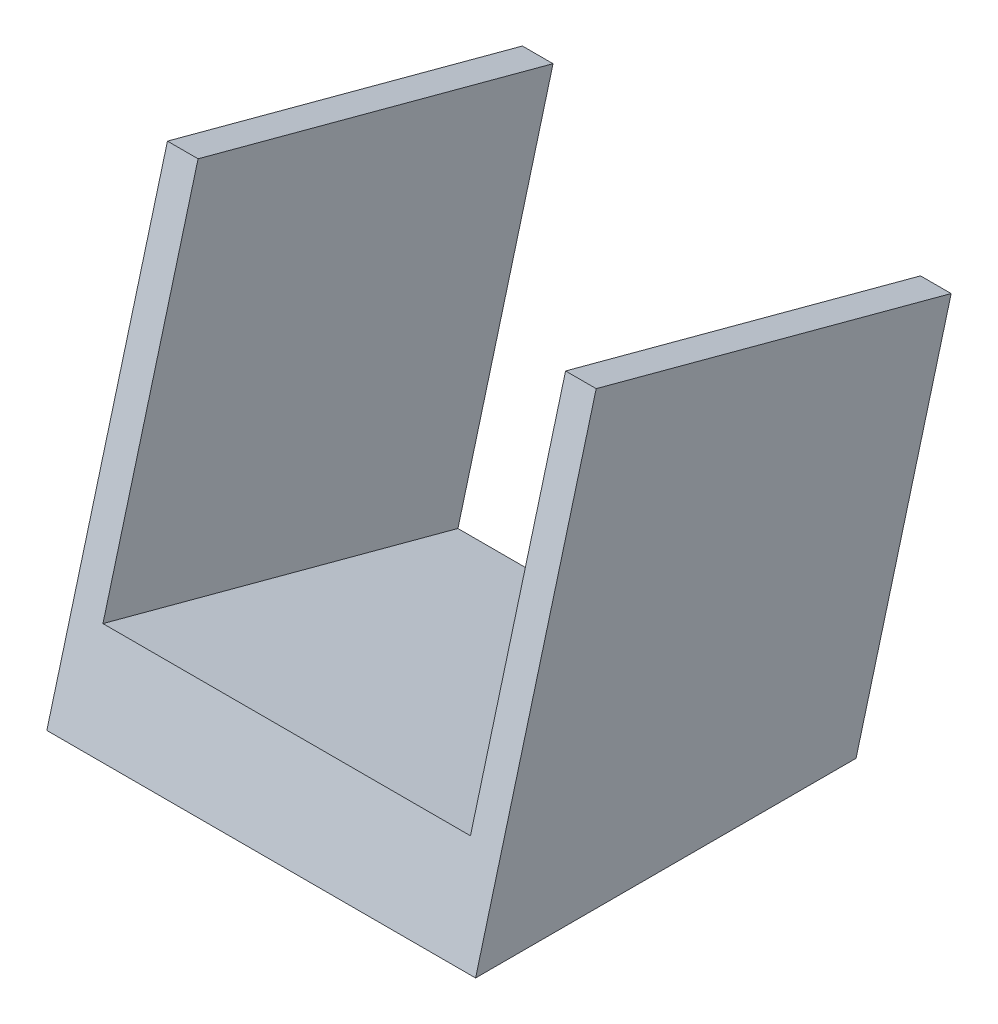
ISO-10303-21;
HEADER;
FILE_DESCRIPTION(('STEP AP214'),'2;1');
FILE_NAME('part.step','',(''),(''),'','','');
FILE_SCHEMA(('AUTOMOTIVE_DESIGN { 1 0 10303 214 1 1 1 1 }'));
ENDSEC;
DATA;
#1=APPLICATION_CONTEXT('core data for automotive mechanical design processes');
#2=APPLICATION_PROTOCOL_DEFINITION('international standard','automotive_design',2000,#1);
#3=PRODUCT_CONTEXT('',#1,'mechanical');
#4=PRODUCT('Part','Part','',(#3));
#5=PRODUCT_RELATED_PRODUCT_CATEGORY('part','',(#4));
#6=PRODUCT_DEFINITION_FORMATION('','',#4);
#7=PRODUCT_DEFINITION_CONTEXT('part definition',#1,'design');
#8=PRODUCT_DEFINITION('design','',#6,#7);
#9=PRODUCT_DEFINITION_SHAPE('','',#8);
#10=(LENGTH_UNIT() NAMED_UNIT(*) SI_UNIT(.MILLI.,.METRE.));
#11=(NAMED_UNIT(*) PLANE_ANGLE_UNIT() SI_UNIT($,.RADIAN.));
#12=(NAMED_UNIT(*) SI_UNIT($,.STERADIAN.) SOLID_ANGLE_UNIT());
#13=UNCERTAINTY_MEASURE_WITH_UNIT(LENGTH_MEASURE(1.E-05),#10,'distance_accuracy_value','');
#14=(GEOMETRIC_REPRESENTATION_CONTEXT(3) GLOBAL_UNCERTAINTY_ASSIGNED_CONTEXT((#13)) GLOBAL_UNIT_ASSIGNED_CONTEXT((#10,
#11,#12)) REPRESENTATION_CONTEXT('',''));
#15=CARTESIAN_POINT('',(0.,0.,0.));
#16=DIRECTION('',(0.,0.,1.));
#17=DIRECTION('',(1.,0.,0.));
#18=AXIS2_PLACEMENT_3D('',#15,#16,#17);
#19=CARTESIAN_POINT('',(44.45,73.6035479632269,-59.1660337104366));
#20=DIRECTION('',(0.,-0.965925826289067,0.258819045102525));
#21=DIRECTION('',(0.,-0.258819045102525,-0.965925826289067));
#22=AXIS2_PLACEMENT_3D('',#19,#20,#21);
#23=PLANE('',#22);
#24=DIRECTION('',(0.,0.258819045102525,0.965925826289067));
#25=VECTOR('',#24,1.);
#26=CARTESIAN_POINT('',(-38.1,93.3255592000394,14.4375142527903));
#27=LINE('',#26,#25);
#28=CARTESIAN_POINT('',(-38.1,73.603547963227,-59.1660337104366));
#29=VERTEX_POINT('',#28);
#30=CARTESIAN_POINT('',(-38.1,93.3255592000394,14.4375142527903));
#31=VERTEX_POINT('',#30);
#32=EDGE_CURVE('E141',#29,#31,#27,.T.);
#33=ORIENTED_EDGE('',*,*,#32,.F.);
#34=DIRECTION('',(-1.,0.,0.));
#35=VECTOR('',#34,1.);
#36=CARTESIAN_POINT('',(44.45,73.6035479632269,-59.1660337104366));
#37=LINE('',#36,#35);
#38=CARTESIAN_POINT('',(-44.45,73.6035479632269,-59.1660337104366));
#39=VERTEX_POINT('',#38);
#40=EDGE_CURVE('E86',#29,#39,#37,.T.);
#41=ORIENTED_EDGE('',*,*,#40,.T.);
#42=DIRECTION('',(0.,0.258819045102525,0.965925826289067));
#43=VECTOR('',#42,1.);
#44=CARTESIAN_POINT('',(-44.45,73.6035479632269,-59.1660337104366));
#45=LINE('',#44,#43);
#46=CARTESIAN_POINT('',(-44.45,93.3255592000394,14.4375142527903));
#47=VERTEX_POINT('',#46);
#48=EDGE_CURVE('E163',#39,#47,#45,.T.);
#49=ORIENTED_EDGE('',*,*,#48,.T.);
#50=DIRECTION('',(-1.,0.,0.));
#51=VECTOR('',#50,1.);
#52=CARTESIAN_POINT('',(44.45,93.3255592000394,14.4375142527903));
#53=LINE('',#52,#51);
#54=EDGE_CURVE('E48',#31,#47,#53,.T.);
#55=ORIENTED_EDGE('',*,*,#54,.F.);
#56=EDGE_LOOP('',(#33,#41,#49,#55));
#57=FACE_BOUND('',#56,.T.);
#58=ADVANCED_FACE('F40',(#57),#23,.F.);
#59=CARTESIAN_POINT('',(44.45,93.3255592000394,14.4375142527903));
#60=DIRECTION('',(0.,-0.258819045102525,-0.965925826289067));
#61=DIRECTION('',(0.,0.965925826289067,-0.258819045102525));
#62=AXIS2_PLACEMENT_3D('',#59,#60,#61);
#63=PLANE('',#62);
#64=DIRECTION('',(0.,-0.965925826289067,0.258819045102525));
#65=VECTOR('',#64,1.);
#66=CARTESIAN_POINT('',(-38.1,19.7220112368124,34.1595254896027));
#67=LINE('',#66,#65);
#68=CARTESIAN_POINT('',(-38.1,19.7220112368124,34.1595254896027));
#69=VERTEX_POINT('',#68);
#70=EDGE_CURVE('E127',#31,#69,#67,.T.);
#71=ORIENTED_EDGE('',*,*,#70,.F.);
#72=ORIENTED_EDGE('',*,*,#54,.T.);
#73=DIRECTION('',(0.,-0.965925826289067,0.258819045102525));
#74=VECTOR('',#73,1.);
#75=CARTESIAN_POINT('',(-44.45,93.3255592000394,14.4375142527903));
#76=LINE('',#75,#74);
#77=CARTESIAN_POINT('',(-44.45,0.,39.4440224736242));
#78=VERTEX_POINT('',#77);
#79=EDGE_CURVE('E159',#47,#78,#76,.T.);
#80=ORIENTED_EDGE('',*,*,#79,.T.);
#81=DIRECTION('',(-1.,0.,0.));
#82=VECTOR('',#81,1.);
#83=CARTESIAN_POINT('',(44.45,0.,39.4440224736242));
#84=LINE('',#83,#82);
#85=CARTESIAN_POINT('',(44.45,0.,39.4440224736242));
#86=VERTEX_POINT('',#85);
#87=EDGE_CURVE('E151',#86,#78,#84,.T.);
#88=ORIENTED_EDGE('',*,*,#87,.F.);
#89=DIRECTION('',(0.,-0.965925826289067,0.258819045102525));
#90=VECTOR('',#89,1.);
#91=CARTESIAN_POINT('',(44.45,93.3255592000394,14.4375142527903));
#92=LINE('',#91,#90);
#93=CARTESIAN_POINT('',(44.45,93.3255592000394,14.4375142527903));
#94=VERTEX_POINT('',#93);
#95=EDGE_CURVE('E93',#94,#86,#92,.T.);
#96=ORIENTED_EDGE('',*,*,#95,.F.);
#97=CARTESIAN_POINT('',(38.1,93.3255592000394,14.4375142527903));
#98=VERTEX_POINT('',#97);
#99=EDGE_CURVE('E11',#94,#98,#53,.T.);
#100=ORIENTED_EDGE('',*,*,#99,.T.);
#101=DIRECTION('',(0.,-0.965925826289067,0.258819045102525));
#102=VECTOR('',#101,1.);
#103=CARTESIAN_POINT('',(38.1,19.7220112368124,34.1595254896027));
#104=LINE('',#103,#102);
#105=CARTESIAN_POINT('',(38.1,19.7220112368124,34.1595254896027));
#106=VERTEX_POINT('',#105);
#107=EDGE_CURVE('E135',#98,#106,#104,.T.);
#108=ORIENTED_EDGE('',*,*,#107,.T.);
#109=DIRECTION('',(1.,0.,0.));
#110=VECTOR('',#109,1.);
#111=CARTESIAN_POINT('',(-38.1,19.7220112368124,34.1595254896027));
#112=LINE('',#111,#110);
#113=EDGE_CURVE('E126',#69,#106,#112,.T.);
#114=ORIENTED_EDGE('',*,*,#113,.F.);
#115=EDGE_LOOP('',(#71,#72,#80,#88,#96,#100,#108,#114));
#116=FACE_BOUND('',#115,.T.);
#117=ADVANCED_FACE('F158',(#116),#63,.F.);
#118=CARTESIAN_POINT('',(44.45,0.,-39.4440224736242));
#119=DIRECTION('',(0.,0.258819045102525,0.965925826289067));
#120=DIRECTION('',(0.,-0.965925826289067,0.258819045102525));
#121=AXIS2_PLACEMENT_3D('',#118,#119,#120);
#122=PLANE('',#121);
#123=DIRECTION('',(0.,0.965925826289067,-0.258819045102525));
#124=VECTOR('',#123,1.);
#125=CARTESIAN_POINT('',(-38.1,0.,-39.4440224736242));
#126=LINE('',#125,#124);
#127=CARTESIAN_POINT('',(-38.1,0.,-39.4440224736242));
#128=VERTEX_POINT('',#127);
#129=EDGE_CURVE('E132',#128,#29,#126,.T.);
#130=ORIENTED_EDGE('',*,*,#129,.F.);
#131=DIRECTION('',(-1.,0.,0.));
#132=VECTOR('',#131,1.);
#133=CARTESIAN_POINT('',(44.45,0.,-39.4440224736242));
#134=LINE('',#133,#132);
#135=CARTESIAN_POINT('',(-44.45,0.,-39.4440224736242));
#136=VERTEX_POINT('',#135);
#137=EDGE_CURVE('E139',#128,#136,#134,.T.);
#138=ORIENTED_EDGE('',*,*,#137,.T.);
#139=DIRECTION('',(0.,0.965925826289067,-0.258819045102525));
#140=VECTOR('',#139,1.);
#141=CARTESIAN_POINT('',(-44.45,0.,-39.4440224736242));
#142=LINE('',#141,#140);
#143=EDGE_CURVE('E170',#136,#39,#142,.T.);
#144=ORIENTED_EDGE('',*,*,#143,.T.);
#145=ORIENTED_EDGE('',*,*,#40,.F.);
#146=EDGE_LOOP('',(#130,#138,#144,#145));
#147=FACE_BOUND('',#146,.T.);
#148=ADVANCED_FACE('F138',(#147),#122,.F.);
#149=CARTESIAN_POINT('',(44.45,73.6035479632269,-59.1660337104366));
#150=VERTEX_POINT('',#149);
#151=CARTESIAN_POINT('',(38.1,73.6035479632269,-59.1660337104366));
#152=VERTEX_POINT('',#151);
#153=EDGE_CURVE('E149',#150,#152,#37,.T.);
#154=ORIENTED_EDGE('',*,*,#153,.T.);
#155=DIRECTION('',(0.,0.258819045102525,0.965925826289067));
#156=VECTOR('',#155,1.);
#157=CARTESIAN_POINT('',(38.1,93.3255592000394,14.4375142527903));
#158=LINE('',#157,#156);
#159=EDGE_CURVE('E55',#152,#98,#158,.T.);
#160=ORIENTED_EDGE('',*,*,#159,.T.);
#161=ORIENTED_EDGE('',*,*,#99,.F.);
#162=DIRECTION('',(0.,0.258819045102525,0.965925826289067));
#163=VECTOR('',#162,1.);
#164=CARTESIAN_POINT('',(44.45,73.6035479632269,-59.1660337104366));
#165=LINE('',#164,#163);
#166=EDGE_CURVE('E171',#150,#94,#165,.T.);
#167=ORIENTED_EDGE('',*,*,#166,.F.);
#168=EDGE_LOOP('',(#154,#160,#161,#167));
#169=FACE_BOUND('',#168,.T.);
#170=ADVANCED_FACE('F42',(#169),#23,.F.);
#171=CARTESIAN_POINT('',(44.45,0.,39.4440224736242));
#172=DIRECTION('',(0.,1.,0.));
#173=DIRECTION('',(0.,0.,1.));
#174=AXIS2_PLACEMENT_3D('',#171,#172,#173);
#175=PLANE('',#174);
#176=DIRECTION('',(0.,0.,-1.));
#177=VECTOR('',#176,1.);
#178=CARTESIAN_POINT('',(-44.45,0.,39.4440224736242));
#179=LINE('',#178,#177);
#180=EDGE_CURVE('E146',#78,#136,#179,.T.);
#181=ORIENTED_EDGE('',*,*,#180,.T.);
#182=ORIENTED_EDGE('',*,*,#137,.F.);
#183=DIRECTION('',(1.,0.,0.));
#184=VECTOR('',#183,1.);
#185=CARTESIAN_POINT('',(-38.1,0.,-39.4440224736242));
#186=LINE('',#185,#184);
#187=CARTESIAN_POINT('',(38.1,0.,-39.4440224736242));
#188=VERTEX_POINT('',#187);
#189=EDGE_CURVE('E115',#128,#188,#186,.T.);
#190=ORIENTED_EDGE('',*,*,#189,.T.);
#191=CARTESIAN_POINT('',(44.45,0.,-39.4440224736242));
#192=VERTEX_POINT('',#191);
#193=EDGE_CURVE('E148',#192,#188,#134,.T.);
#194=ORIENTED_EDGE('',*,*,#193,.F.);
#195=DIRECTION('',(0.,0.,-1.));
#196=VECTOR('',#195,1.);
#197=CARTESIAN_POINT('',(44.45,0.,39.4440224736242));
#198=LINE('',#197,#196);
#199=EDGE_CURVE('E175',#86,#192,#198,.T.);
#200=ORIENTED_EDGE('',*,*,#199,.F.);
#201=ORIENTED_EDGE('',*,*,#87,.T.);
#202=EDGE_LOOP('',(#181,#182,#190,#194,#200,#201));
#203=FACE_BOUND('',#202,.T.);
#204=ADVANCED_FACE('F143',(#203),#175,.F.);
#205=ORIENTED_EDGE('',*,*,#193,.T.);
#206=DIRECTION('',(0.,0.965925826289067,-0.258819045102525));
#207=VECTOR('',#206,1.);
#208=CARTESIAN_POINT('',(38.1,0.,-39.4440224736242));
#209=LINE('',#208,#207);
#210=EDGE_CURVE('E180',#188,#152,#209,.T.);
#211=ORIENTED_EDGE('',*,*,#210,.T.);
#212=ORIENTED_EDGE('',*,*,#153,.F.);
#213=DIRECTION('',(0.,0.965925826289067,-0.258819045102525));
#214=VECTOR('',#213,1.);
#215=CARTESIAN_POINT('',(44.45,0.,-39.4440224736242));
#216=LINE('',#215,#214);
#217=EDGE_CURVE('E64',#192,#150,#216,.T.);
#218=ORIENTED_EDGE('',*,*,#217,.F.);
#219=EDGE_LOOP('',(#205,#211,#212,#218));
#220=FACE_BOUND('',#219,.T.);
#221=ADVANCED_FACE('F179',(#220),#122,.F.);
#222=CARTESIAN_POINT('',(44.45,0.,0.));
#223=DIRECTION('',(1.,0.,0.));
#224=DIRECTION('',(0.,0.,-1.));
#225=AXIS2_PLACEMENT_3D('',#222,#223,#224);
#226=PLANE('',#225);
#227=ORIENTED_EDGE('',*,*,#166,.T.);
#228=ORIENTED_EDGE('',*,*,#95,.T.);
#229=ORIENTED_EDGE('',*,*,#199,.T.);
#230=ORIENTED_EDGE('',*,*,#217,.T.);
#231=EDGE_LOOP('',(#227,#228,#229,#230));
#232=FACE_BOUND('',#231,.T.);
#233=ADVANCED_FACE('F177',(#232),#226,.T.);
#234=CARTESIAN_POINT('',(-44.45,0.,0.));
#235=DIRECTION('',(1.,0.,0.));
#236=DIRECTION('',(0.,0.,-1.));
#237=AXIS2_PLACEMENT_3D('',#234,#235,#236);
#238=PLANE('',#237);
#239=ORIENTED_EDGE('',*,*,#48,.F.);
#240=ORIENTED_EDGE('',*,*,#143,.F.);
#241=ORIENTED_EDGE('',*,*,#180,.F.);
#242=ORIENTED_EDGE('',*,*,#79,.F.);
#243=EDGE_LOOP('',(#239,#240,#241,#242));
#244=FACE_BOUND('',#243,.T.);
#245=ADVANCED_FACE('F162',(#244),#238,.F.);
#246=CARTESIAN_POINT('',(-38.1,19.7220112368124,34.1595254896027));
#247=DIRECTION('',(0.,-0.965925826289067,0.258819045102525));
#248=DIRECTION('',(0.,-0.258819045102525,-0.965925826289067));
#249=AXIS2_PLACEMENT_3D('',#246,#247,#248);
#250=PLANE('',#249);
#251=DIRECTION('',(0.,-0.258819045102525,-0.965925826289067));
#252=VECTOR('',#251,1.);
#253=CARTESIAN_POINT('',(38.1,19.7220112368124,34.1595254896027));
#254=LINE('',#253,#252);
#255=EDGE_CURVE('E121',#106,#188,#254,.T.);
#256=ORIENTED_EDGE('',*,*,#255,.T.);
#257=ORIENTED_EDGE('',*,*,#189,.F.);
#258=DIRECTION('',(0.,-0.258819045102525,-0.965925826289067));
#259=VECTOR('',#258,1.);
#260=CARTESIAN_POINT('',(-38.1,19.7220112368124,34.1595254896027));
#261=LINE('',#260,#259);
#262=EDGE_CURVE('E118',#69,#128,#261,.T.);
#263=ORIENTED_EDGE('',*,*,#262,.F.);
#264=ORIENTED_EDGE('',*,*,#113,.T.);
#265=EDGE_LOOP('',(#256,#257,#263,#264));
#266=FACE_BOUND('',#265,.T.);
#267=ADVANCED_FACE('F117',(#266),#250,.F.);
#268=CARTESIAN_POINT('',(-38.1,0.,0.));
#269=DIRECTION('',(1.,0.,0.));
#270=DIRECTION('',(0.,0.,-1.));
#271=AXIS2_PLACEMENT_3D('',#268,#269,#270);
#272=PLANE('',#271);
#273=ORIENTED_EDGE('',*,*,#262,.T.);
#274=ORIENTED_EDGE('',*,*,#129,.T.);
#275=ORIENTED_EDGE('',*,*,#32,.T.);
#276=ORIENTED_EDGE('',*,*,#70,.T.);
#277=EDGE_LOOP('',(#273,#274,#275,#276));
#278=FACE_BOUND('',#277,.T.);
#279=ADVANCED_FACE('F131',(#278),#272,.T.);
#280=CARTESIAN_POINT('',(38.1,0.,0.));
#281=DIRECTION('',(1.,0.,0.));
#282=DIRECTION('',(0.,0.,-1.));
#283=AXIS2_PLACEMENT_3D('',#280,#281,#282);
#284=PLANE('',#283);
#285=ORIENTED_EDGE('',*,*,#255,.F.);
#286=ORIENTED_EDGE('',*,*,#107,.F.);
#287=ORIENTED_EDGE('',*,*,#159,.F.);
#288=ORIENTED_EDGE('',*,*,#210,.F.);
#289=EDGE_LOOP('',(#285,#286,#287,#288));
#290=FACE_BOUND('',#289,.T.);
#291=ADVANCED_FACE('F189',(#290),#284,.F.);
#292=CLOSED_SHELL('',(#58,#117,#148,#170,#204,#221,#233,#245,#267,#279,#291));
#293=MANIFOLD_SOLID_BREP('B2',#292);
#294=ADVANCED_BREP_SHAPE_REPRESENTATION('',(#18,#293),#14);
#295=SHAPE_DEFINITION_REPRESENTATION(#9,#294);
ENDSEC;
END-ISO-10303-21;
